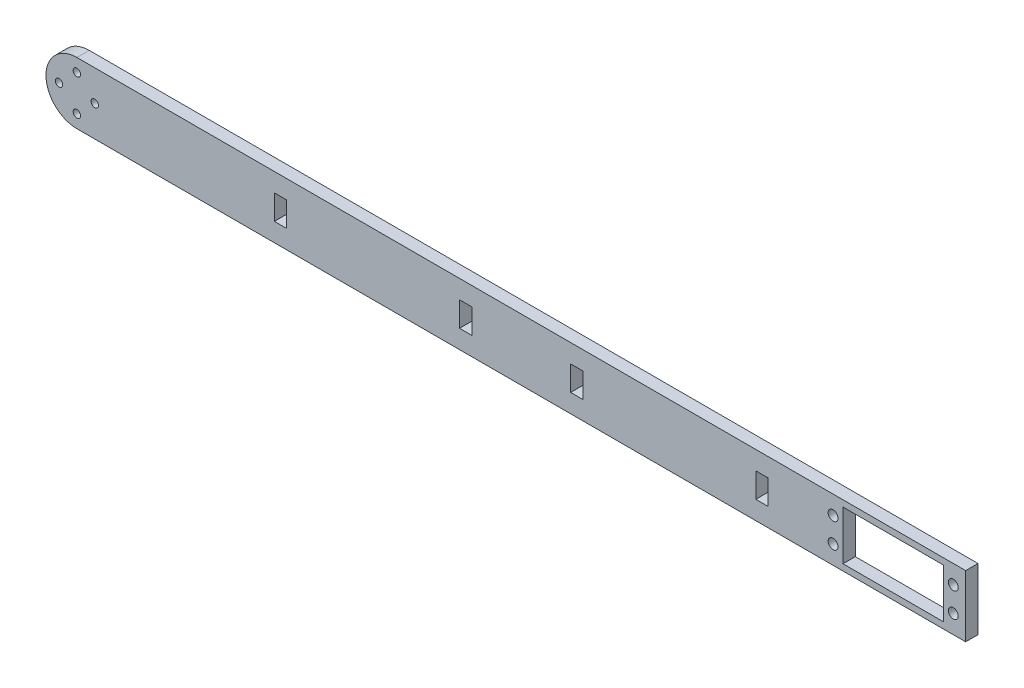
ISO-10303-21;
HEADER;
FILE_DESCRIPTION(('STEP AP214'),'2;1');
FILE_NAME('part.step','',(''),(''),'','','');
FILE_SCHEMA(('AUTOMOTIVE_DESIGN { 1 0 10303 214 1 1 1 1 }'));
ENDSEC;
DATA;
#1=APPLICATION_CONTEXT('core data for automotive mechanical design processes');
#2=APPLICATION_PROTOCOL_DEFINITION('international standard','automotive_design',2000,#1);
#3=PRODUCT_CONTEXT('',#1,'mechanical');
#4=PRODUCT('Part','Part','',(#3));
#5=PRODUCT_RELATED_PRODUCT_CATEGORY('part','',(#4));
#6=PRODUCT_DEFINITION_FORMATION('','',#4);
#7=PRODUCT_DEFINITION_CONTEXT('part definition',#1,'design');
#8=PRODUCT_DEFINITION('design','',#6,#7);
#9=PRODUCT_DEFINITION_SHAPE('','',#8);
#10=(LENGTH_UNIT() NAMED_UNIT(*) SI_UNIT(.MILLI.,.METRE.));
#11=(NAMED_UNIT(*) PLANE_ANGLE_UNIT() SI_UNIT($,.RADIAN.));
#12=(NAMED_UNIT(*) SI_UNIT($,.STERADIAN.) SOLID_ANGLE_UNIT());
#13=UNCERTAINTY_MEASURE_WITH_UNIT(LENGTH_MEASURE(1.E-05),#10,'distance_accuracy_value','');
#14=(GEOMETRIC_REPRESENTATION_CONTEXT(3) GLOBAL_UNCERTAINTY_ASSIGNED_CONTEXT((#13)) GLOBAL_UNIT_ASSIGNED_CONTEXT((#10,
#11,#12)) REPRESENTATION_CONTEXT('',''));
#15=CARTESIAN_POINT('',(0.,0.,0.));
#16=DIRECTION('',(0.,0.,1.));
#17=DIRECTION('',(1.,0.,0.));
#18=AXIS2_PLACEMENT_3D('',#15,#16,#17);
#19=CARTESIAN_POINT('',(0.,0.,5.));
#20=DIRECTION('',(0.,0.,1.));
#21=DIRECTION('',(1.,0.,0.));
#22=AXIS2_PLACEMENT_3D('',#19,#20,#21);
#23=PLANE('',#22);
#24=CARTESIAN_POINT('',(355.,-5.,5.));
#25=DIRECTION('',(0.,0.,1.));
#26=DIRECTION('',(-1.,0.,0.));
#27=AXIS2_PLACEMENT_3D('',#24,#25,#26);
#28=CIRCLE('',#27,2.);
#29=CARTESIAN_POINT('',(353.,-5.,5.));
#30=VERTEX_POINT('',#29);
#31=EDGE_CURVE('E908',#30,#30,#28,.T.);
#32=ORIENTED_EDGE('',*,*,#31,.F.);
#33=EDGE_LOOP('',(#32));
#34=FACE_BOUND('',#33,.T.);
#35=CARTESIAN_POINT('',(306.3,5.,5.));
#36=DIRECTION('',(0.,0.,1.));
#37=DIRECTION('',(-1.,0.,0.));
#38=AXIS2_PLACEMENT_3D('',#35,#36,#37);
#39=CIRCLE('',#38,2.);
#40=CARTESIAN_POINT('',(304.3,5.,5.));
#41=VERTEX_POINT('',#40);
#42=EDGE_CURVE('E916',#41,#41,#39,.T.);
#43=ORIENTED_EDGE('',*,*,#42,.F.);
#44=EDGE_LOOP('',(#43));
#45=FACE_BOUND('',#44,.T.);
#46=CARTESIAN_POINT('',(306.3,-5.,5.));
#47=DIRECTION('',(0.,0.,1.));
#48=DIRECTION('',(1.,0.,0.));
#49=AXIS2_PLACEMENT_3D('',#46,#47,#48);
#50=CIRCLE('',#49,2.);
#51=CARTESIAN_POINT('',(308.3,-5.,5.));
#52=VERTEX_POINT('',#51);
#53=EDGE_CURVE('E991',#52,#52,#50,.T.);
#54=ORIENTED_EDGE('',*,*,#53,.F.);
#55=EDGE_LOOP('',(#54));
#56=FACE_BOUND('',#55,.T.);
#57=CARTESIAN_POINT('',(355.,5.,5.));
#58=DIRECTION('',(0.,0.,1.));
#59=DIRECTION('',(1.,0.,0.));
#60=AXIS2_PLACEMENT_3D('',#57,#58,#59);
#61=CIRCLE('',#60,2.);
#62=CARTESIAN_POINT('',(357.,5.,5.));
#63=VERTEX_POINT('',#62);
#64=EDGE_CURVE('E295',#63,#63,#61,.T.);
#65=ORIENTED_EDGE('',*,*,#64,.F.);
#66=EDGE_LOOP('',(#65));
#67=FACE_BOUND('',#66,.T.);
#68=DIRECTION('',(-1.,0.,0.));
#69=VECTOR('',#68,1.);
#70=CARTESIAN_POINT('',(85.,5.,5.));
#71=LINE('',#70,#69);
#72=CARTESIAN_POINT('',(85.,5.,5.));
#73=VERTEX_POINT('',#72);
#74=CARTESIAN_POINT('',(80.,5.,5.));
#75=VERTEX_POINT('',#74);
#76=EDGE_CURVE('E114',#73,#75,#71,.T.);
#77=ORIENTED_EDGE('',*,*,#76,.F.);
#78=DIRECTION('',(0.,1.,0.));
#79=VECTOR('',#78,1.);
#80=CARTESIAN_POINT('',(85.,-5.,5.));
#81=LINE('',#80,#79);
#82=CARTESIAN_POINT('',(85.,-5.,5.));
#83=VERTEX_POINT('',#82);
#84=EDGE_CURVE('E367',#83,#73,#81,.T.);
#85=ORIENTED_EDGE('',*,*,#84,.F.);
#86=DIRECTION('',(1.,0.,0.));
#87=VECTOR('',#86,1.);
#88=CARTESIAN_POINT('',(85.,-5.,5.));
#89=LINE('',#88,#87);
#90=CARTESIAN_POINT('',(80.,-5.,5.));
#91=VERTEX_POINT('',#90);
#92=EDGE_CURVE('E387',#91,#83,#89,.T.);
#93=ORIENTED_EDGE('',*,*,#92,.F.);
#94=DIRECTION('',(0.,-1.,0.));
#95=VECTOR('',#94,1.);
#96=CARTESIAN_POINT('',(80.,-5.,5.));
#97=LINE('',#96,#95);
#98=EDGE_CURVE('E382',#75,#91,#97,.T.);
#99=ORIENTED_EDGE('',*,*,#98,.F.);
#100=EDGE_LOOP('',(#77,#85,#93,#99));
#101=FACE_BOUND('',#100,.T.);
#102=DIRECTION('',(1.,0.,0.));
#103=VECTOR('',#102,1.);
#104=CARTESIAN_POINT('',(205.,-4.99999999999973,5.));
#105=LINE('',#104,#103);
#106=CARTESIAN_POINT('',(200.,-4.9999999999997,5.));
#107=VERTEX_POINT('',#106);
#108=CARTESIAN_POINT('',(205.,-4.99999999999973,5.));
#109=VERTEX_POINT('',#108);
#110=EDGE_CURVE('E122',#107,#109,#105,.T.);
#111=ORIENTED_EDGE('',*,*,#110,.F.);
#112=DIRECTION('',(0.,-1.,0.));
#113=VECTOR('',#112,1.);
#114=CARTESIAN_POINT('',(200.,-4.9999999999997,5.));
#115=LINE('',#114,#113);
#116=CARTESIAN_POINT('',(200.,5.0000000000003,5.));
#117=VERTEX_POINT('',#116);
#118=EDGE_CURVE('E325',#117,#107,#115,.T.);
#119=ORIENTED_EDGE('',*,*,#118,.F.);
#120=DIRECTION('',(-1.,0.,0.));
#121=VECTOR('',#120,1.);
#122=CARTESIAN_POINT('',(205.,5.00000000000026,5.));
#123=LINE('',#122,#121);
#124=CARTESIAN_POINT('',(205.,5.00000000000026,5.));
#125=VERTEX_POINT('',#124);
#126=EDGE_CURVE('E345',#125,#117,#123,.T.);
#127=ORIENTED_EDGE('',*,*,#126,.F.);
#128=DIRECTION('',(0.,1.,0.));
#129=VECTOR('',#128,1.);
#130=CARTESIAN_POINT('',(205.,-4.99999999999973,5.));
#131=LINE('',#130,#129);
#132=EDGE_CURVE('E340',#109,#125,#131,.T.);
#133=ORIENTED_EDGE('',*,*,#132,.F.);
#134=EDGE_LOOP('',(#111,#119,#127,#133));
#135=FACE_BOUND('',#134,.T.);
#136=DIRECTION('',(0.,-1.,0.));
#137=VECTOR('',#136,1.);
#138=CARTESIAN_POINT('',(275.,-4.99999999999934,5.));
#139=LINE('',#138,#137);
#140=CARTESIAN_POINT('',(275.,5.00000000000065,5.));
#141=VERTEX_POINT('',#140);
#142=CARTESIAN_POINT('',(275.,-4.99999999999934,5.));
#143=VERTEX_POINT('',#142);
#144=EDGE_CURVE('E267',#141,#143,#139,.T.);
#145=ORIENTED_EDGE('',*,*,#144,.F.);
#146=DIRECTION('',(-1.,0.,0.));
#147=VECTOR('',#146,1.);
#148=CARTESIAN_POINT('',(275.,5.00000000000065,5.));
#149=LINE('',#148,#147);
#150=CARTESIAN_POINT('',(280.,5.00000000000074,5.));
#151=VERTEX_POINT('',#150);
#152=EDGE_CURVE('E288',#151,#141,#149,.T.);
#153=ORIENTED_EDGE('',*,*,#152,.F.);
#154=DIRECTION('',(0.,1.,0.));
#155=VECTOR('',#154,1.);
#156=CARTESIAN_POINT('',(280.,-4.99999999999925,5.));
#157=LINE('',#156,#155);
#158=CARTESIAN_POINT('',(280.,-4.99999999999925,5.));
#159=VERTEX_POINT('',#158);
#160=EDGE_CURVE('E292',#159,#151,#157,.T.);
#161=ORIENTED_EDGE('',*,*,#160,.F.);
#162=DIRECTION('',(1.,0.,0.));
#163=VECTOR('',#162,1.);
#164=CARTESIAN_POINT('',(275.,-4.99999999999934,5.));
#165=LINE('',#164,#163);
#166=EDGE_CURVE('E304',#143,#159,#165,.T.);
#167=ORIENTED_EDGE('',*,*,#166,.F.);
#168=EDGE_LOOP('',(#145,#153,#161,#167));
#169=FACE_BOUND('',#168,.T.);
#170=DIRECTION('',(0.,-1.,0.));
#171=VECTOR('',#170,1.);
#172=CARTESIAN_POINT('',(155.,-4.99999999999973,5.));
#173=LINE('',#172,#171);
#174=CARTESIAN_POINT('',(155.,5.00000000000026,5.));
#175=VERTEX_POINT('',#174);
#176=CARTESIAN_POINT('',(155.,-4.99999999999973,5.));
#177=VERTEX_POINT('',#176);
#178=EDGE_CURVE('E314',#175,#177,#173,.T.);
#179=ORIENTED_EDGE('',*,*,#178,.F.);
#180=DIRECTION('',(-1.,0.,0.));
#181=VECTOR('',#180,1.);
#182=CARTESIAN_POINT('',(155.,5.00000000000026,5.));
#183=LINE('',#182,#181);
#184=CARTESIAN_POINT('',(160.,5.0000000000003,5.));
#185=VERTEX_POINT('',#184);
#186=EDGE_CURVE('E409',#185,#175,#183,.T.);
#187=ORIENTED_EDGE('',*,*,#186,.F.);
#188=DIRECTION('',(0.,1.,0.));
#189=VECTOR('',#188,1.);
#190=CARTESIAN_POINT('',(160.,-4.9999999999997,5.));
#191=LINE('',#190,#189);
#192=CARTESIAN_POINT('',(160.,-4.9999999999997,5.));
#193=VERTEX_POINT('',#192);
#194=EDGE_CURVE('E428',#193,#185,#191,.T.);
#195=ORIENTED_EDGE('',*,*,#194,.F.);
#196=DIRECTION('',(1.,0.,0.));
#197=VECTOR('',#196,1.);
#198=CARTESIAN_POINT('',(155.,-4.99999999999973,5.));
#199=LINE('',#198,#197);
#200=EDGE_CURVE('E424',#177,#193,#199,.T.);
#201=ORIENTED_EDGE('',*,*,#200,.F.);
#202=EDGE_LOOP('',(#179,#187,#195,#201));
#203=FACE_BOUND('',#202,.T.);
#204=DIRECTION('',(-1.,0.,0.));
#205=VECTOR('',#204,1.);
#206=CARTESIAN_POINT('',(310.3,9.95,5.));
#207=LINE('',#206,#205);
#208=CARTESIAN_POINT('',(351.,9.95,5.));
#209=VERTEX_POINT('',#208);
#210=CARTESIAN_POINT('',(310.3,9.95,5.));
#211=VERTEX_POINT('',#210);
#212=EDGE_CURVE('E438',#209,#211,#207,.T.);
#213=ORIENTED_EDGE('',*,*,#212,.F.);
#214=DIRECTION('',(0.,1.,0.));
#215=VECTOR('',#214,1.);
#216=CARTESIAN_POINT('',(351.,9.95,5.));
#217=LINE('',#216,#215);
#218=CARTESIAN_POINT('',(351.,-9.95,5.));
#219=VERTEX_POINT('',#218);
#220=EDGE_CURVE('E453',#219,#209,#217,.T.);
#221=ORIENTED_EDGE('',*,*,#220,.F.);
#222=DIRECTION('',(1.,0.,0.));
#223=VECTOR('',#222,1.);
#224=CARTESIAN_POINT('',(351.,-9.95,5.));
#225=LINE('',#224,#223);
#226=CARTESIAN_POINT('',(310.3,-9.95,5.));
#227=VERTEX_POINT('',#226);
#228=EDGE_CURVE('E472',#227,#219,#225,.T.);
#229=ORIENTED_EDGE('',*,*,#228,.F.);
#230=DIRECTION('',(0.,-1.,0.));
#231=VECTOR('',#230,1.);
#232=CARTESIAN_POINT('',(310.3,-9.95,5.));
#233=LINE('',#232,#231);
#234=EDGE_CURVE('E468',#211,#227,#233,.T.);
#235=ORIENTED_EDGE('',*,*,#234,.F.);
#236=EDGE_LOOP('',(#213,#221,#229,#235));
#237=FACE_BOUND('',#236,.T.);
#238=CARTESIAN_POINT('',(7.2500000000002,-2.05613458905738E-13,5.));
#239=DIRECTION('',(0.,0.,1.));
#240=DIRECTION('',(1.,0.,0.));
#241=AXIS2_PLACEMENT_3D('',#238,#239,#240);
#242=CIRCLE('',#241,1.5);
#243=CARTESIAN_POINT('',(8.75000000000021,-2.05613458905738E-13,5.));
#244=VERTEX_POINT('',#243);
#245=EDGE_CURVE('E500',#244,#244,#242,.T.);
#246=ORIENTED_EDGE('',*,*,#245,.F.);
#247=EDGE_LOOP('',(#246));
#248=FACE_BOUND('',#247,.T.);
#249=CARTESIAN_POINT('',(-7.2499999999998,-2.05613458905738E-13,5.));
#250=DIRECTION('',(0.,0.,1.));
#251=DIRECTION('',(1.,0.,0.));
#252=AXIS2_PLACEMENT_3D('',#249,#250,#251);
#253=CIRCLE('',#252,1.5);
#254=CARTESIAN_POINT('',(-5.74999999999979,-2.05613458905738E-13,5.));
#255=VERTEX_POINT('',#254);
#256=EDGE_CURVE('E516',#255,#255,#253,.T.);
#257=ORIENTED_EDGE('',*,*,#256,.F.);
#258=EDGE_LOOP('',(#257));
#259=FACE_BOUND('',#258,.T.);
#260=CARTESIAN_POINT('',(0.,0.,5.));
#261=DIRECTION('',(0.,0.,1.));
#262=DIRECTION('',(1.,0.,0.));
#263=AXIS2_PLACEMENT_3D('',#260,#261,#262);
#264=CIRCLE('',#263,12.5);
#265=CARTESIAN_POINT('',(0.,12.5,5.));
#266=VERTEX_POINT('',#265);
#267=CARTESIAN_POINT('',(0.,-12.5,5.));
#268=VERTEX_POINT('',#267);
#269=EDGE_CURVE('E524',#266,#268,#264,.T.);
#270=ORIENTED_EDGE('',*,*,#269,.T.);
#271=DIRECTION('',(1.,0.,0.));
#272=VECTOR('',#271,1.);
#273=CARTESIAN_POINT('',(0.,-12.5,5.));
#274=LINE('',#273,#272);
#275=CARTESIAN_POINT('',(360.,-12.5,5.));
#276=VERTEX_POINT('',#275);
#277=EDGE_CURVE('E528',#268,#276,#274,.T.);
#278=ORIENTED_EDGE('',*,*,#277,.T.);
#279=DIRECTION('',(0.,-1.,0.));
#280=VECTOR('',#279,1.);
#281=CARTESIAN_POINT('',(360.,12.5,5.));
#282=LINE('',#281,#280);
#283=CARTESIAN_POINT('',(360.,12.5,5.));
#284=VERTEX_POINT('',#283);
#285=EDGE_CURVE('E532',#284,#276,#282,.T.);
#286=ORIENTED_EDGE('',*,*,#285,.F.);
#287=DIRECTION('',(1.,0.,0.));
#288=VECTOR('',#287,1.);
#289=CARTESIAN_POINT('',(0.,12.5,5.));
#290=LINE('',#289,#288);
#291=EDGE_CURVE('E536',#266,#284,#290,.T.);
#292=ORIENTED_EDGE('',*,*,#291,.F.);
#293=EDGE_LOOP('',(#270,#278,#286,#292));
#294=FACE_BOUND('',#293,.T.);
#295=CARTESIAN_POINT('',(2.05595492690342E-13,7.24999999999979,5.));
#296=DIRECTION('',(0.,0.,1.));
#297=DIRECTION('',(1.,0.,0.));
#298=AXIS2_PLACEMENT_3D('',#295,#296,#297);
#299=CIRCLE('',#298,1.5);
#300=CARTESIAN_POINT('',(1.50000000000021,7.24999999999979,5.));
#301=VERTEX_POINT('',#300);
#302=EDGE_CURVE('E508',#301,#301,#299,.T.);
#303=ORIENTED_EDGE('',*,*,#302,.F.);
#304=EDGE_LOOP('',(#303));
#305=FACE_BOUND('',#304,.T.);
#306=CARTESIAN_POINT('',(2.03819754831578E-13,-7.25000000000021,5.));
#307=DIRECTION('',(0.,0.,1.));
#308=DIRECTION('',(1.,0.,0.));
#309=AXIS2_PLACEMENT_3D('',#306,#307,#308);
#310=CIRCLE('',#309,1.5);
#311=CARTESIAN_POINT('',(1.5000000000002,-7.25000000000021,5.));
#312=VERTEX_POINT('',#311);
#313=EDGE_CURVE('E492',#312,#312,#310,.T.);
#314=ORIENTED_EDGE('',*,*,#313,.F.);
#315=EDGE_LOOP('',(#314));
#316=FACE_BOUND('',#315,.T.);
#317=ADVANCED_FACE('F98',(#34,#45,#56,#67,#101,#135,#169,#203,#237,#248,#259,#294,#305,#316),
#23,.T.);
#318=CARTESIAN_POINT('',(0.,0.,0.));
#319=DIRECTION('',(0.,0.,1.));
#320=DIRECTION('',(1.,0.,0.));
#321=AXIS2_PLACEMENT_3D('',#318,#319,#320);
#322=PLANE('',#321);
#323=CARTESIAN_POINT('',(355.,-5.,0.));
#324=DIRECTION('',(0.,0.,1.));
#325=DIRECTION('',(-1.,0.,0.));
#326=AXIS2_PLACEMENT_3D('',#323,#324,#325);
#327=CIRCLE('',#326,2.);
#328=CARTESIAN_POINT('',(353.,-5.,0.));
#329=VERTEX_POINT('',#328);
#330=EDGE_CURVE('E906',#329,#329,#327,.T.);
#331=ORIENTED_EDGE('',*,*,#330,.T.);
#332=EDGE_LOOP('',(#331));
#333=FACE_BOUND('',#332,.T.);
#334=CARTESIAN_POINT('',(306.3,5.,0.));
#335=DIRECTION('',(0.,0.,1.));
#336=DIRECTION('',(-1.,0.,0.));
#337=AXIS2_PLACEMENT_3D('',#334,#335,#336);
#338=CIRCLE('',#337,2.);
#339=CARTESIAN_POINT('',(304.3,5.,0.));
#340=VERTEX_POINT('',#339);
#341=EDGE_CURVE('E910',#340,#340,#338,.T.);
#342=ORIENTED_EDGE('',*,*,#341,.T.);
#343=EDGE_LOOP('',(#342));
#344=FACE_BOUND('',#343,.T.);
#345=CARTESIAN_POINT('',(306.3,-5.,0.));
#346=DIRECTION('',(0.,0.,1.));
#347=DIRECTION('',(1.,0.,0.));
#348=AXIS2_PLACEMENT_3D('',#345,#346,#347);
#349=CIRCLE('',#348,2.);
#350=CARTESIAN_POINT('',(308.3,-5.,0.));
#351=VERTEX_POINT('',#350);
#352=EDGE_CURVE('E922',#351,#351,#349,.T.);
#353=ORIENTED_EDGE('',*,*,#352,.T.);
#354=EDGE_LOOP('',(#353));
#355=FACE_BOUND('',#354,.T.);
#356=CARTESIAN_POINT('',(355.,5.,0.));
#357=DIRECTION('',(0.,0.,1.));
#358=DIRECTION('',(1.,0.,0.));
#359=AXIS2_PLACEMENT_3D('',#356,#357,#358);
#360=CIRCLE('',#359,2.);
#361=CARTESIAN_POINT('',(357.,5.,0.));
#362=VERTEX_POINT('',#361);
#363=EDGE_CURVE('E383',#362,#362,#360,.T.);
#364=ORIENTED_EDGE('',*,*,#363,.T.);
#365=EDGE_LOOP('',(#364));
#366=FACE_BOUND('',#365,.T.);
#367=DIRECTION('',(0.,1.,0.));
#368=VECTOR('',#367,1.);
#369=CARTESIAN_POINT('',(85.,-5.,0.));
#370=LINE('',#369,#368);
#371=CARTESIAN_POINT('',(85.,-5.,0.));
#372=VERTEX_POINT('',#371);
#373=CARTESIAN_POINT('',(85.,5.,0.));
#374=VERTEX_POINT('',#373);
#375=EDGE_CURVE('E375',#372,#374,#370,.T.);
#376=ORIENTED_EDGE('',*,*,#375,.T.);
#377=DIRECTION('',(-1.,0.,0.));
#378=VECTOR('',#377,1.);
#379=CARTESIAN_POINT('',(85.,5.,0.));
#380=LINE('',#379,#378);
#381=CARTESIAN_POINT('',(80.,5.,0.));
#382=VERTEX_POINT('',#381);
#383=EDGE_CURVE('E362',#374,#382,#380,.T.);
#384=ORIENTED_EDGE('',*,*,#383,.T.);
#385=DIRECTION('',(0.,-1.,0.));
#386=VECTOR('',#385,1.);
#387=CARTESIAN_POINT('',(80.,-5.,0.));
#388=LINE('',#387,#386);
#389=CARTESIAN_POINT('',(80.,-5.,0.));
#390=VERTEX_POINT('',#389);
#391=EDGE_CURVE('E366',#382,#390,#388,.T.);
#392=ORIENTED_EDGE('',*,*,#391,.T.);
#393=DIRECTION('',(1.,0.,0.));
#394=VECTOR('',#393,1.);
#395=CARTESIAN_POINT('',(85.,-5.,0.));
#396=LINE('',#395,#394);
#397=EDGE_CURVE('E371',#390,#372,#396,.T.);
#398=ORIENTED_EDGE('',*,*,#397,.T.);
#399=EDGE_LOOP('',(#376,#384,#392,#398));
#400=FACE_BOUND('',#399,.T.);
#401=DIRECTION('',(0.,-1.,0.));
#402=VECTOR('',#401,1.);
#403=CARTESIAN_POINT('',(200.,-4.9999999999997,0.));
#404=LINE('',#403,#402);
#405=CARTESIAN_POINT('',(200.,5.0000000000003,0.));
#406=VERTEX_POINT('',#405);
#407=CARTESIAN_POINT('',(200.,-4.9999999999997,0.));
#408=VERTEX_POINT('',#407);
#409=EDGE_CURVE('E333',#406,#408,#404,.T.);
#410=ORIENTED_EDGE('',*,*,#409,.T.);
#411=DIRECTION('',(1.,0.,0.));
#412=VECTOR('',#411,1.);
#413=CARTESIAN_POINT('',(205.,-4.99999999999973,0.));
#414=LINE('',#413,#412);
#415=CARTESIAN_POINT('',(205.,-4.99999999999973,0.));
#416=VERTEX_POINT('',#415);
#417=EDGE_CURVE('E320',#408,#416,#414,.T.);
#418=ORIENTED_EDGE('',*,*,#417,.T.);
#419=DIRECTION('',(0.,1.,0.));
#420=VECTOR('',#419,1.);
#421=CARTESIAN_POINT('',(205.,-4.99999999999973,0.));
#422=LINE('',#421,#420);
#423=CARTESIAN_POINT('',(205.,5.00000000000026,0.));
#424=VERTEX_POINT('',#423);
#425=EDGE_CURVE('E324',#416,#424,#422,.T.);
#426=ORIENTED_EDGE('',*,*,#425,.T.);
#427=DIRECTION('',(-1.,0.,0.));
#428=VECTOR('',#427,1.);
#429=CARTESIAN_POINT('',(205.,5.00000000000026,0.));
#430=LINE('',#429,#428);
#431=EDGE_CURVE('E329',#424,#406,#430,.T.);
#432=ORIENTED_EDGE('',*,*,#431,.T.);
#433=EDGE_LOOP('',(#410,#418,#426,#432));
#434=FACE_BOUND('',#433,.T.);
#435=DIRECTION('',(-1.,0.,0.));
#436=VECTOR('',#435,1.);
#437=CARTESIAN_POINT('',(275.,5.00000000000065,0.));
#438=LINE('',#437,#436);
#439=CARTESIAN_POINT('',(280.,5.00000000000074,0.));
#440=VERTEX_POINT('',#439);
#441=CARTESIAN_POINT('',(275.,5.00000000000065,0.));
#442=VERTEX_POINT('',#441);
#443=EDGE_CURVE('E273',#440,#442,#438,.T.);
#444=ORIENTED_EDGE('',*,*,#443,.T.);
#445=DIRECTION('',(0.,-1.,0.));
#446=VECTOR('',#445,1.);
#447=CARTESIAN_POINT('',(275.,-4.99999999999934,0.));
#448=LINE('',#447,#446);
#449=CARTESIAN_POINT('',(275.,-4.99999999999934,0.));
#450=VERTEX_POINT('',#449);
#451=EDGE_CURVE('E264',#442,#450,#448,.T.);
#452=ORIENTED_EDGE('',*,*,#451,.T.);
#453=DIRECTION('',(1.,0.,0.));
#454=VECTOR('',#453,1.);
#455=CARTESIAN_POINT('',(275.,-4.99999999999934,0.));
#456=LINE('',#455,#454);
#457=CARTESIAN_POINT('',(280.,-4.99999999999925,0.));
#458=VERTEX_POINT('',#457);
#459=EDGE_CURVE('E277',#450,#458,#456,.T.);
#460=ORIENTED_EDGE('',*,*,#459,.T.);
#461=DIRECTION('',(0.,1.,0.));
#462=VECTOR('',#461,1.);
#463=CARTESIAN_POINT('',(280.,-4.99999999999925,0.));
#464=LINE('',#463,#462);
#465=EDGE_CURVE('E282',#458,#440,#464,.T.);
#466=ORIENTED_EDGE('',*,*,#465,.T.);
#467=EDGE_LOOP('',(#444,#452,#460,#466));
#468=FACE_BOUND('',#467,.T.);
#469=DIRECTION('',(-1.,0.,0.));
#470=VECTOR('',#469,1.);
#471=CARTESIAN_POINT('',(155.,5.00000000000026,0.));
#472=LINE('',#471,#470);
#473=CARTESIAN_POINT('',(160.,5.0000000000003,0.));
#474=VERTEX_POINT('',#473);
#475=CARTESIAN_POINT('',(155.,5.00000000000026,0.));
#476=VERTEX_POINT('',#475);
#477=EDGE_CURVE('E417',#474,#476,#472,.T.);
#478=ORIENTED_EDGE('',*,*,#477,.T.);
#479=DIRECTION('',(0.,-1.,0.));
#480=VECTOR('',#479,1.);
#481=CARTESIAN_POINT('',(155.,-4.99999999999973,0.));
#482=LINE('',#481,#480);
#483=CARTESIAN_POINT('',(155.,-4.99999999999973,0.));
#484=VERTEX_POINT('',#483);
#485=EDGE_CURVE('E404',#476,#484,#482,.T.);
#486=ORIENTED_EDGE('',*,*,#485,.T.);
#487=DIRECTION('',(1.,0.,0.));
#488=VECTOR('',#487,1.);
#489=CARTESIAN_POINT('',(155.,-4.99999999999973,0.));
#490=LINE('',#489,#488);
#491=CARTESIAN_POINT('',(160.,-4.9999999999997,0.));
#492=VERTEX_POINT('',#491);
#493=EDGE_CURVE('E408',#484,#492,#490,.T.);
#494=ORIENTED_EDGE('',*,*,#493,.T.);
#495=DIRECTION('',(0.,1.,0.));
#496=VECTOR('',#495,1.);
#497=CARTESIAN_POINT('',(160.,-4.9999999999997,0.));
#498=LINE('',#497,#496);
#499=EDGE_CURVE('E413',#492,#474,#498,.T.);
#500=ORIENTED_EDGE('',*,*,#499,.T.);
#501=EDGE_LOOP('',(#478,#486,#494,#500));
#502=FACE_BOUND('',#501,.T.);
#503=DIRECTION('',(0.,1.,0.));
#504=VECTOR('',#503,1.);
#505=CARTESIAN_POINT('',(351.,9.95,0.));
#506=LINE('',#505,#504);
#507=CARTESIAN_POINT('',(351.,-9.95,0.));
#508=VERTEX_POINT('',#507);
#509=CARTESIAN_POINT('',(351.,9.95,0.));
#510=VERTEX_POINT('',#509);
#511=EDGE_CURVE('E461',#508,#510,#506,.T.);
#512=ORIENTED_EDGE('',*,*,#511,.T.);
#513=DIRECTION('',(-1.,0.,0.));
#514=VECTOR('',#513,1.);
#515=CARTESIAN_POINT('',(310.3,9.95,0.));
#516=LINE('',#515,#514);
#517=CARTESIAN_POINT('',(310.3,9.95,0.));
#518=VERTEX_POINT('',#517);
#519=EDGE_CURVE('E448',#510,#518,#516,.T.);
#520=ORIENTED_EDGE('',*,*,#519,.T.);
#521=DIRECTION('',(0.,-1.,0.));
#522=VECTOR('',#521,1.);
#523=CARTESIAN_POINT('',(310.3,-9.95,0.));
#524=LINE('',#523,#522);
#525=CARTESIAN_POINT('',(310.3,-9.95,0.));
#526=VERTEX_POINT('',#525);
#527=EDGE_CURVE('E452',#518,#526,#524,.T.);
#528=ORIENTED_EDGE('',*,*,#527,.T.);
#529=DIRECTION('',(1.,0.,0.));
#530=VECTOR('',#529,1.);
#531=CARTESIAN_POINT('',(351.,-9.95,0.));
#532=LINE('',#531,#530);
#533=EDGE_CURVE('E457',#526,#508,#532,.T.);
#534=ORIENTED_EDGE('',*,*,#533,.T.);
#535=EDGE_LOOP('',(#512,#520,#528,#534));
#536=FACE_BOUND('',#535,.T.);
#537=CARTESIAN_POINT('',(0.,0.,0.));
#538=DIRECTION('',(0.,0.,1.));
#539=DIRECTION('',(1.,0.,0.));
#540=AXIS2_PLACEMENT_3D('',#537,#538,#539);
#541=CIRCLE('',#540,12.5);
#542=CARTESIAN_POINT('',(0.,12.5,0.));
#543=VERTEX_POINT('',#542);
#544=CARTESIAN_POINT('',(0.,-12.5,0.));
#545=VERTEX_POINT('',#544);
#546=EDGE_CURVE('E520',#543,#545,#541,.T.);
#547=ORIENTED_EDGE('',*,*,#546,.F.);
#548=DIRECTION('',(1.,0.,0.));
#549=VECTOR('',#548,1.);
#550=CARTESIAN_POINT('',(0.,12.5,0.));
#551=LINE('',#550,#549);
#552=CARTESIAN_POINT('',(360.,12.5,0.));
#553=VERTEX_POINT('',#552);
#554=EDGE_CURVE('E529',#543,#553,#551,.T.);
#555=ORIENTED_EDGE('',*,*,#554,.T.);
#556=DIRECTION('',(0.,-1.,0.));
#557=VECTOR('',#556,1.);
#558=CARTESIAN_POINT('',(360.,12.5,0.));
#559=LINE('',#558,#557);
#560=CARTESIAN_POINT('',(360.,-12.5,0.));
#561=VERTEX_POINT('',#560);
#562=EDGE_CURVE('E548',#553,#561,#559,.T.);
#563=ORIENTED_EDGE('',*,*,#562,.T.);
#564=DIRECTION('',(1.,0.,0.));
#565=VECTOR('',#564,1.);
#566=CARTESIAN_POINT('',(0.,-12.5,0.));
#567=LINE('',#566,#565);
#568=EDGE_CURVE('E544',#545,#561,#567,.T.);
#569=ORIENTED_EDGE('',*,*,#568,.F.);
#570=EDGE_LOOP('',(#547,#555,#563,#569));
#571=FACE_BOUND('',#570,.T.);
#572=CARTESIAN_POINT('',(-7.2499999999998,-2.05613458905738E-13,0.));
#573=DIRECTION('',(0.,0.,1.));
#574=DIRECTION('',(1.,0.,0.));
#575=AXIS2_PLACEMENT_3D('',#572,#573,#574);
#576=CIRCLE('',#575,1.5);
#577=CARTESIAN_POINT('',(-5.74999999999979,-2.05613458905738E-13,0.));
#578=VERTEX_POINT('',#577);
#579=EDGE_CURVE('E512',#578,#578,#576,.T.);
#580=ORIENTED_EDGE('',*,*,#579,.T.);
#581=EDGE_LOOP('',(#580));
#582=FACE_BOUND('',#581,.T.);
#583=CARTESIAN_POINT('',(2.05595492690342E-13,7.24999999999979,0.));
#584=DIRECTION('',(0.,0.,1.));
#585=DIRECTION('',(1.,0.,0.));
#586=AXIS2_PLACEMENT_3D('',#583,#584,#585);
#587=CIRCLE('',#586,1.5);
#588=CARTESIAN_POINT('',(1.50000000000021,7.24999999999979,0.));
#589=VERTEX_POINT('',#588);
#590=EDGE_CURVE('E504',#589,#589,#587,.T.);
#591=ORIENTED_EDGE('',*,*,#590,.T.);
#592=EDGE_LOOP('',(#591));
#593=FACE_BOUND('',#592,.T.);
#594=CARTESIAN_POINT('',(7.2500000000002,-2.05613458905738E-13,0.));
#595=DIRECTION('',(0.,0.,1.));
#596=DIRECTION('',(1.,0.,0.));
#597=AXIS2_PLACEMENT_3D('',#594,#595,#596);
#598=CIRCLE('',#597,1.5);
#599=CARTESIAN_POINT('',(8.75000000000021,-2.05613458905738E-13,0.));
#600=VERTEX_POINT('',#599);
#601=EDGE_CURVE('E496',#600,#600,#598,.T.);
#602=ORIENTED_EDGE('',*,*,#601,.T.);
#603=EDGE_LOOP('',(#602));
#604=FACE_BOUND('',#603,.T.);
#605=CARTESIAN_POINT('',(2.03819754831578E-13,-7.25000000000021,0.));
#606=DIRECTION('',(0.,0.,1.));
#607=DIRECTION('',(1.,0.,0.));
#608=AXIS2_PLACEMENT_3D('',#605,#606,#607);
#609=CIRCLE('',#608,1.5);
#610=CARTESIAN_POINT('',(1.5000000000002,-7.25000000000021,0.));
#611=VERTEX_POINT('',#610);
#612=EDGE_CURVE('E482',#611,#611,#609,.T.);
#613=ORIENTED_EDGE('',*,*,#612,.T.);
#614=EDGE_LOOP('',(#613));
#615=FACE_BOUND('',#614,.T.);
#616=ADVANCED_FACE('F284',(#333,#344,#355,#366,#400,#434,#468,#502,#536,#571,#582,#593,#604,
#615),#322,.F.);
#617=CARTESIAN_POINT('',(0.,0.,5.));
#618=DIRECTION('',(0.,0.,-1.));
#619=DIRECTION('',(-1.,0.,0.));
#620=AXIS2_PLACEMENT_3D('',#617,#618,#619);
#621=CYLINDRICAL_SURFACE('',#620,12.5);
#622=ORIENTED_EDGE('',*,*,#546,.T.);
#623=DIRECTION('',(0.,0.,-1.));
#624=VECTOR('',#623,1.);
#625=CARTESIAN_POINT('',(0.,-12.5,5.));
#626=LINE('',#625,#624);
#627=EDGE_CURVE('E12',#268,#545,#626,.T.);
#628=ORIENTED_EDGE('',*,*,#627,.F.);
#629=ORIENTED_EDGE('',*,*,#269,.F.);
#630=DIRECTION('',(0.,0.,-1.));
#631=VECTOR('',#630,1.);
#632=CARTESIAN_POINT('',(0.,12.5,5.));
#633=LINE('',#632,#631);
#634=EDGE_CURVE('E540',#266,#543,#633,.T.);
#635=ORIENTED_EDGE('',*,*,#634,.T.);
#636=EDGE_LOOP('',(#622,#628,#629,#635));
#637=FACE_BOUND('',#636,.T.);
#638=ADVANCED_FACE('F100',(#637),#621,.T.);
#639=CARTESIAN_POINT('',(0.,-12.5,5.));
#640=DIRECTION('',(0.,1.,0.));
#641=DIRECTION('',(0.,0.,1.));
#642=AXIS2_PLACEMENT_3D('',#639,#640,#641);
#643=PLANE('',#642);
#644=ORIENTED_EDGE('',*,*,#568,.T.);
#645=DIRECTION('',(0.,0.,-1.));
#646=VECTOR('',#645,1.);
#647=CARTESIAN_POINT('',(360.,-12.5,5.));
#648=LINE('',#647,#646);
#649=EDGE_CURVE('E107',#276,#561,#648,.T.);
#650=ORIENTED_EDGE('',*,*,#649,.F.);
#651=ORIENTED_EDGE('',*,*,#277,.F.);
#652=ORIENTED_EDGE('',*,*,#627,.T.);
#653=EDGE_LOOP('',(#644,#650,#651,#652));
#654=FACE_BOUND('',#653,.T.);
#655=ADVANCED_FACE('F566',(#654),#643,.F.);
#656=CARTESIAN_POINT('',(360.,12.5,5.));
#657=DIRECTION('',(1.,0.,0.));
#658=DIRECTION('',(0.,0.,-1.));
#659=AXIS2_PLACEMENT_3D('',#656,#657,#658);
#660=PLANE('',#659);
#661=ORIENTED_EDGE('',*,*,#562,.F.);
#662=DIRECTION('',(0.,0.,-1.));
#663=VECTOR('',#662,1.);
#664=CARTESIAN_POINT('',(360.,12.5,5.));
#665=LINE('',#664,#663);
#666=EDGE_CURVE('E557',#284,#553,#665,.T.);
#667=ORIENTED_EDGE('',*,*,#666,.F.);
#668=ORIENTED_EDGE('',*,*,#285,.T.);
#669=ORIENTED_EDGE('',*,*,#649,.T.);
#670=EDGE_LOOP('',(#661,#667,#668,#669));
#671=FACE_BOUND('',#670,.T.);
#672=ADVANCED_FACE('F563',(#671),#660,.T.);
#673=CARTESIAN_POINT('',(0.,12.5,5.));
#674=DIRECTION('',(0.,1.,0.));
#675=DIRECTION('',(0.,0.,1.));
#676=AXIS2_PLACEMENT_3D('',#673,#674,#675);
#677=PLANE('',#676);
#678=ORIENTED_EDGE('',*,*,#554,.F.);
#679=ORIENTED_EDGE('',*,*,#634,.F.);
#680=ORIENTED_EDGE('',*,*,#291,.T.);
#681=ORIENTED_EDGE('',*,*,#666,.T.);
#682=EDGE_LOOP('',(#678,#679,#680,#681));
#683=FACE_BOUND('',#682,.T.);
#684=ADVANCED_FACE('F573',(#683),#677,.T.);
#685=CARTESIAN_POINT('',(-7.2499999999998,-2.05613458905738E-13,5.));
#686=DIRECTION('',(0.,0.,-1.));
#687=DIRECTION('',(-1.,0.,0.));
#688=AXIS2_PLACEMENT_3D('',#685,#686,#687);
#689=CYLINDRICAL_SURFACE('',#688,1.5);
#690=ORIENTED_EDGE('',*,*,#256,.T.);
#691=EDGE_LOOP('',(#690));
#692=FACE_BOUND('',#691,.T.);
#693=ORIENTED_EDGE('',*,*,#579,.F.);
#694=EDGE_LOOP('',(#693));
#695=FACE_BOUND('',#694,.T.);
#696=ADVANCED_FACE('F594',(#692,#695),#689,.F.);
#697=CARTESIAN_POINT('',(2.05595492690342E-13,7.24999999999979,5.));
#698=DIRECTION('',(0.,0.,-1.));
#699=DIRECTION('',(-1.,0.,0.));
#700=AXIS2_PLACEMENT_3D('',#697,#698,#699);
#701=CYLINDRICAL_SURFACE('',#700,1.5);
#702=ORIENTED_EDGE('',*,*,#302,.T.);
#703=EDGE_LOOP('',(#702));
#704=FACE_BOUND('',#703,.T.);
#705=ORIENTED_EDGE('',*,*,#590,.F.);
#706=EDGE_LOOP('',(#705));
#707=FACE_BOUND('',#706,.T.);
#708=ADVANCED_FACE('F614',(#704,#707),#701,.F.);
#709=CARTESIAN_POINT('',(7.2500000000002,-2.05613458905738E-13,5.));
#710=DIRECTION('',(0.,0.,-1.));
#711=DIRECTION('',(-1.,0.,0.));
#712=AXIS2_PLACEMENT_3D('',#709,#710,#711);
#713=CYLINDRICAL_SURFACE('',#712,1.5);
#714=ORIENTED_EDGE('',*,*,#245,.T.);
#715=EDGE_LOOP('',(#714));
#716=FACE_BOUND('',#715,.T.);
#717=ORIENTED_EDGE('',*,*,#601,.F.);
#718=EDGE_LOOP('',(#717));
#719=FACE_BOUND('',#718,.T.);
#720=ADVANCED_FACE('F621',(#716,#719),#713,.F.);
#721=CARTESIAN_POINT('',(2.03819754831578E-13,-7.25000000000021,5.));
#722=DIRECTION('',(0.,0.,-1.));
#723=DIRECTION('',(-1.,0.,0.));
#724=AXIS2_PLACEMENT_3D('',#721,#722,#723);
#725=CYLINDRICAL_SURFACE('',#724,1.5);
#726=ORIENTED_EDGE('',*,*,#313,.T.);
#727=EDGE_LOOP('',(#726));
#728=FACE_BOUND('',#727,.T.);
#729=ORIENTED_EDGE('',*,*,#612,.F.);
#730=EDGE_LOOP('',(#729));
#731=FACE_BOUND('',#730,.T.);
#732=ADVANCED_FACE('F628',(#728,#731),#725,.F.);
#733=CARTESIAN_POINT('',(310.3,9.95,0.));
#734=DIRECTION('',(0.,1.,0.));
#735=DIRECTION('',(0.,0.,1.));
#736=AXIS2_PLACEMENT_3D('',#733,#734,#735);
#737=PLANE('',#736);
#738=ORIENTED_EDGE('',*,*,#212,.T.);
#739=DIRECTION('',(0.,0.,1.));
#740=VECTOR('',#739,1.);
#741=CARTESIAN_POINT('',(310.3,9.95,0.));
#742=LINE('',#741,#740);
#743=EDGE_CURVE('E465',#518,#211,#742,.T.);
#744=ORIENTED_EDGE('',*,*,#743,.F.);
#745=ORIENTED_EDGE('',*,*,#519,.F.);
#746=DIRECTION('',(0.,0.,1.));
#747=VECTOR('',#746,1.);
#748=CARTESIAN_POINT('',(351.,9.95,0.));
#749=LINE('',#748,#747);
#750=EDGE_CURVE('E479',#510,#209,#749,.T.);
#751=ORIENTED_EDGE('',*,*,#750,.T.);
#752=EDGE_LOOP('',(#738,#744,#745,#751));
#753=FACE_BOUND('',#752,.T.);
#754=ADVANCED_FACE('F636',(#753),#737,.F.);
#755=CARTESIAN_POINT('',(351.,9.95,0.));
#756=DIRECTION('',(1.,0.,0.));
#757=DIRECTION('',(0.,0.,-1.));
#758=AXIS2_PLACEMENT_3D('',#755,#756,#757);
#759=PLANE('',#758);
#760=ORIENTED_EDGE('',*,*,#220,.T.);
#761=ORIENTED_EDGE('',*,*,#750,.F.);
#762=ORIENTED_EDGE('',*,*,#511,.F.);
#763=DIRECTION('',(0.,0.,1.));
#764=VECTOR('',#763,1.);
#765=CARTESIAN_POINT('',(351.,-9.95,0.));
#766=LINE('',#765,#764);
#767=EDGE_CURVE('E483',#508,#219,#766,.T.);
#768=ORIENTED_EDGE('',*,*,#767,.T.);
#769=EDGE_LOOP('',(#760,#761,#762,#768));
#770=FACE_BOUND('',#769,.T.);
#771=ADVANCED_FACE('F644',(#770),#759,.F.);
#772=CARTESIAN_POINT('',(351.,-9.95,0.));
#773=DIRECTION('',(0.,-1.,0.));
#774=DIRECTION('',(1.,0.,0.));
#775=AXIS2_PLACEMENT_3D('',#772,#773,#774);
#776=PLANE('',#775);
#777=ORIENTED_EDGE('',*,*,#228,.T.);
#778=ORIENTED_EDGE('',*,*,#767,.F.);
#779=ORIENTED_EDGE('',*,*,#533,.F.);
#780=DIRECTION('',(0.,0.,1.));
#781=VECTOR('',#780,1.);
#782=CARTESIAN_POINT('',(310.3,-9.95,0.));
#783=LINE('',#782,#781);
#784=EDGE_CURVE('E486',#526,#227,#783,.T.);
#785=ORIENTED_EDGE('',*,*,#784,.T.);
#786=EDGE_LOOP('',(#777,#778,#779,#785));
#787=FACE_BOUND('',#786,.T.);
#788=ADVANCED_FACE('F652',(#787),#776,.F.);
#789=CARTESIAN_POINT('',(310.3,-9.95,0.));
#790=DIRECTION('',(-1.,0.,0.));
#791=DIRECTION('',(0.,0.,1.));
#792=AXIS2_PLACEMENT_3D('',#789,#790,#791);
#793=PLANE('',#792);
#794=ORIENTED_EDGE('',*,*,#234,.T.);
#795=ORIENTED_EDGE('',*,*,#784,.F.);
#796=ORIENTED_EDGE('',*,*,#527,.F.);
#797=ORIENTED_EDGE('',*,*,#743,.T.);
#798=EDGE_LOOP('',(#794,#795,#796,#797));
#799=FACE_BOUND('',#798,.T.);
#800=ADVANCED_FACE('F660',(#799),#793,.F.);
#801=CARTESIAN_POINT('',(155.,-4.99999999999973,0.));
#802=DIRECTION('',(-1.,0.,0.));
#803=DIRECTION('',(0.,-1.,0.));
#804=AXIS2_PLACEMENT_3D('',#801,#802,#803);
#805=PLANE('',#804);
#806=ORIENTED_EDGE('',*,*,#178,.T.);
#807=DIRECTION('',(0.,0.,1.));
#808=VECTOR('',#807,1.);
#809=CARTESIAN_POINT('',(155.,-4.99999999999973,0.));
#810=LINE('',#809,#808);
#811=EDGE_CURVE('E421',#484,#177,#810,.T.);
#812=ORIENTED_EDGE('',*,*,#811,.F.);
#813=ORIENTED_EDGE('',*,*,#485,.F.);
#814=DIRECTION('',(0.,0.,1.));
#815=VECTOR('',#814,1.);
#816=CARTESIAN_POINT('',(155.,5.00000000000026,0.));
#817=LINE('',#816,#815);
#818=EDGE_CURVE('E435',#476,#175,#817,.T.);
#819=ORIENTED_EDGE('',*,*,#818,.T.);
#820=EDGE_LOOP('',(#806,#812,#813,#819));
#821=FACE_BOUND('',#820,.T.);
#822=ADVANCED_FACE('F668',(#821),#805,.F.);
#823=CARTESIAN_POINT('',(155.,5.00000000000026,0.));
#824=DIRECTION('',(0.,1.,0.));
#825=DIRECTION('',(-1.,0.,0.));
#826=AXIS2_PLACEMENT_3D('',#823,#824,#825);
#827=PLANE('',#826);
#828=ORIENTED_EDGE('',*,*,#186,.T.);
#829=ORIENTED_EDGE('',*,*,#818,.F.);
#830=ORIENTED_EDGE('',*,*,#477,.F.);
#831=DIRECTION('',(0.,0.,1.));
#832=VECTOR('',#831,1.);
#833=CARTESIAN_POINT('',(160.,5.0000000000003,0.));
#834=LINE('',#833,#832);
#835=EDGE_CURVE('E439',#474,#185,#834,.T.);
#836=ORIENTED_EDGE('',*,*,#835,.T.);
#837=EDGE_LOOP('',(#828,#829,#830,#836));
#838=FACE_BOUND('',#837,.T.);
#839=ADVANCED_FACE('F676',(#838),#827,.F.);
#840=CARTESIAN_POINT('',(160.,-4.9999999999997,0.));
#841=DIRECTION('',(1.,0.,0.));
#842=DIRECTION('',(0.,1.,0.));
#843=AXIS2_PLACEMENT_3D('',#840,#841,#842);
#844=PLANE('',#843);
#845=ORIENTED_EDGE('',*,*,#194,.T.);
#846=ORIENTED_EDGE('',*,*,#835,.F.);
#847=ORIENTED_EDGE('',*,*,#499,.F.);
#848=DIRECTION('',(0.,0.,1.));
#849=VECTOR('',#848,1.);
#850=CARTESIAN_POINT('',(160.,-4.9999999999997,0.));
#851=LINE('',#850,#849);
#852=EDGE_CURVE('E442',#492,#193,#851,.T.);
#853=ORIENTED_EDGE('',*,*,#852,.T.);
#854=EDGE_LOOP('',(#845,#846,#847,#853));
#855=FACE_BOUND('',#854,.T.);
#856=ADVANCED_FACE('F684',(#855),#844,.F.);
#857=CARTESIAN_POINT('',(155.,-4.99999999999973,0.));
#858=DIRECTION('',(0.,-1.,0.));
#859=DIRECTION('',(1.,0.,0.));
#860=AXIS2_PLACEMENT_3D('',#857,#858,#859);
#861=PLANE('',#860);
#862=ORIENTED_EDGE('',*,*,#200,.T.);
#863=ORIENTED_EDGE('',*,*,#852,.F.);
#864=ORIENTED_EDGE('',*,*,#493,.F.);
#865=ORIENTED_EDGE('',*,*,#811,.T.);
#866=EDGE_LOOP('',(#862,#863,#864,#865));
#867=FACE_BOUND('',#866,.T.);
#868=ADVANCED_FACE('F692',(#867),#861,.F.);
#869=CARTESIAN_POINT('',(275.,-4.99999999999934,0.));
#870=DIRECTION('',(-1.,0.,0.));
#871=DIRECTION('',(0.,-1.,0.));
#872=AXIS2_PLACEMENT_3D('',#869,#870,#871);
#873=PLANE('',#872);
#874=ORIENTED_EDGE('',*,*,#144,.T.);
#875=DIRECTION('',(0.,0.,1.));
#876=VECTOR('',#875,1.);
#877=CARTESIAN_POINT('',(275.,-4.99999999999934,0.));
#878=LINE('',#877,#876);
#879=EDGE_CURVE('E260',#450,#143,#878,.T.);
#880=ORIENTED_EDGE('',*,*,#879,.F.);
#881=ORIENTED_EDGE('',*,*,#451,.F.);
#882=DIRECTION('',(0.,0.,1.));
#883=VECTOR('',#882,1.);
#884=CARTESIAN_POINT('',(275.,5.00000000000065,0.));
#885=LINE('',#884,#883);
#886=EDGE_CURVE('E311',#442,#141,#885,.T.);
#887=ORIENTED_EDGE('',*,*,#886,.T.);
#888=EDGE_LOOP('',(#874,#880,#881,#887));
#889=FACE_BOUND('',#888,.T.);
#890=ADVANCED_FACE('F262',(#889),#873,.F.);
#891=CARTESIAN_POINT('',(275.,5.00000000000065,0.));
#892=DIRECTION('',(0.,1.,0.));
#893=DIRECTION('',(-1.,0.,0.));
#894=AXIS2_PLACEMENT_3D('',#891,#892,#893);
#895=PLANE('',#894);
#896=ORIENTED_EDGE('',*,*,#152,.T.);
#897=ORIENTED_EDGE('',*,*,#886,.F.);
#898=ORIENTED_EDGE('',*,*,#443,.F.);
#899=DIRECTION('',(0.,0.,1.));
#900=VECTOR('',#899,1.);
#901=CARTESIAN_POINT('',(280.,5.00000000000074,0.));
#902=LINE('',#901,#900);
#903=EDGE_CURVE('E315',#440,#151,#902,.T.);
#904=ORIENTED_EDGE('',*,*,#903,.T.);
#905=EDGE_LOOP('',(#896,#897,#898,#904));
#906=FACE_BOUND('',#905,.T.);
#907=ADVANCED_FACE('F707',(#906),#895,.F.);
#908=CARTESIAN_POINT('',(280.,-4.99999999999925,0.));
#909=DIRECTION('',(1.,0.,0.));
#910=DIRECTION('',(0.,1.,0.));
#911=AXIS2_PLACEMENT_3D('',#908,#909,#910);
#912=PLANE('',#911);
#913=ORIENTED_EDGE('',*,*,#160,.T.);
#914=ORIENTED_EDGE('',*,*,#903,.F.);
#915=ORIENTED_EDGE('',*,*,#465,.F.);
#916=DIRECTION('',(0.,0.,1.));
#917=VECTOR('',#916,1.);
#918=CARTESIAN_POINT('',(280.,-4.99999999999925,0.));
#919=LINE('',#918,#917);
#920=EDGE_CURVE('E272',#458,#159,#919,.T.);
#921=ORIENTED_EDGE('',*,*,#920,.T.);
#922=EDGE_LOOP('',(#913,#914,#915,#921));
#923=FACE_BOUND('',#922,.T.);
#924=ADVANCED_FACE('F714',(#923),#912,.F.);
#925=CARTESIAN_POINT('',(275.,-4.99999999999934,0.));
#926=DIRECTION('',(0.,-1.,0.));
#927=DIRECTION('',(1.,0.,0.));
#928=AXIS2_PLACEMENT_3D('',#925,#926,#927);
#929=PLANE('',#928);
#930=ORIENTED_EDGE('',*,*,#166,.T.);
#931=ORIENTED_EDGE('',*,*,#920,.F.);
#932=ORIENTED_EDGE('',*,*,#459,.F.);
#933=ORIENTED_EDGE('',*,*,#879,.T.);
#934=EDGE_LOOP('',(#930,#931,#932,#933));
#935=FACE_BOUND('',#934,.T.);
#936=ADVANCED_FACE('F278',(#935),#929,.F.);
#937=CARTESIAN_POINT('',(205.,-4.99999999999973,0.));
#938=DIRECTION('',(0.,-1.,0.));
#939=DIRECTION('',(1.,0.,0.));
#940=AXIS2_PLACEMENT_3D('',#937,#938,#939);
#941=PLANE('',#940);
#942=ORIENTED_EDGE('',*,*,#110,.T.);
#943=DIRECTION('',(0.,0.,1.));
#944=VECTOR('',#943,1.);
#945=CARTESIAN_POINT('',(205.,-4.99999999999973,0.));
#946=LINE('',#945,#944);
#947=EDGE_CURVE('E337',#416,#109,#946,.T.);
#948=ORIENTED_EDGE('',*,*,#947,.F.);
#949=ORIENTED_EDGE('',*,*,#417,.F.);
#950=DIRECTION('',(0.,0.,1.));
#951=VECTOR('',#950,1.);
#952=CARTESIAN_POINT('',(200.,-4.9999999999997,0.));
#953=LINE('',#952,#951);
#954=EDGE_CURVE('E305',#408,#107,#953,.T.);
#955=ORIENTED_EDGE('',*,*,#954,.T.);
#956=EDGE_LOOP('',(#942,#948,#949,#955));
#957=FACE_BOUND('',#956,.T.);
#958=ADVANCED_FACE('F729',(#957),#941,.F.);
#959=CARTESIAN_POINT('',(200.,-4.9999999999997,0.));
#960=DIRECTION('',(-1.,0.,0.));
#961=DIRECTION('',(0.,-1.,0.));
#962=AXIS2_PLACEMENT_3D('',#959,#960,#961);
#963=PLANE('',#962);
#964=ORIENTED_EDGE('',*,*,#118,.T.);
#965=ORIENTED_EDGE('',*,*,#954,.F.);
#966=ORIENTED_EDGE('',*,*,#409,.F.);
#967=DIRECTION('',(0.,0.,1.));
#968=VECTOR('',#967,1.);
#969=CARTESIAN_POINT('',(200.,5.0000000000003,0.));
#970=LINE('',#969,#968);
#971=EDGE_CURVE('E354',#406,#117,#970,.T.);
#972=ORIENTED_EDGE('',*,*,#971,.T.);
#973=EDGE_LOOP('',(#964,#965,#966,#972));
#974=FACE_BOUND('',#973,.T.);
#975=ADVANCED_FACE('F736',(#974),#963,.F.);
#976=CARTESIAN_POINT('',(205.,5.00000000000026,0.));
#977=DIRECTION('',(0.,1.,0.));
#978=DIRECTION('',(-1.,0.,0.));
#979=AXIS2_PLACEMENT_3D('',#976,#977,#978);
#980=PLANE('',#979);
#981=ORIENTED_EDGE('',*,*,#126,.T.);
#982=ORIENTED_EDGE('',*,*,#971,.F.);
#983=ORIENTED_EDGE('',*,*,#431,.F.);
#984=DIRECTION('',(0.,0.,1.));
#985=VECTOR('',#984,1.);
#986=CARTESIAN_POINT('',(205.,5.00000000000026,0.));
#987=LINE('',#986,#985);
#988=EDGE_CURVE('E357',#424,#125,#987,.T.);
#989=ORIENTED_EDGE('',*,*,#988,.T.);
#990=EDGE_LOOP('',(#981,#982,#983,#989));
#991=FACE_BOUND('',#990,.T.);
#992=ADVANCED_FACE('F743',(#991),#980,.F.);
#993=CARTESIAN_POINT('',(205.,-4.99999999999973,0.));
#994=DIRECTION('',(1.,0.,0.));
#995=DIRECTION('',(0.,1.,0.));
#996=AXIS2_PLACEMENT_3D('',#993,#994,#995);
#997=PLANE('',#996);
#998=ORIENTED_EDGE('',*,*,#132,.T.);
#999=ORIENTED_EDGE('',*,*,#988,.F.);
#1000=ORIENTED_EDGE('',*,*,#425,.F.);
#1001=ORIENTED_EDGE('',*,*,#947,.T.);
#1002=EDGE_LOOP('',(#998,#999,#1000,#1001));
#1003=FACE_BOUND('',#1002,.T.);
#1004=ADVANCED_FACE('F751',(#1003),#997,.F.);
#1005=CARTESIAN_POINT('',(85.,5.,0.));
#1006=DIRECTION('',(0.,1.,0.));
#1007=DIRECTION('',(-1.,0.,0.));
#1008=AXIS2_PLACEMENT_3D('',#1005,#1006,#1007);
#1009=PLANE('',#1008);
#1010=ORIENTED_EDGE('',*,*,#76,.T.);
#1011=DIRECTION('',(0.,0.,1.));
#1012=VECTOR('',#1011,1.);
#1013=CARTESIAN_POINT('',(80.,5.,0.));
#1014=LINE('',#1013,#1012);
#1015=EDGE_CURVE('E379',#382,#75,#1014,.T.);
#1016=ORIENTED_EDGE('',*,*,#1015,.F.);
#1017=ORIENTED_EDGE('',*,*,#383,.F.);
#1018=DIRECTION('',(0.,0.,1.));
#1019=VECTOR('',#1018,1.);
#1020=CARTESIAN_POINT('',(85.,5.,0.));
#1021=LINE('',#1020,#1019);
#1022=EDGE_CURVE('E341',#374,#73,#1021,.T.);
#1023=ORIENTED_EDGE('',*,*,#1022,.T.);
#1024=EDGE_LOOP('',(#1010,#1016,#1017,#1023));
#1025=FACE_BOUND('',#1024,.T.);
#1026=ADVANCED_FACE('F759',(#1025),#1009,.F.);
#1027=CARTESIAN_POINT('',(85.,-5.,0.));
#1028=DIRECTION('',(1.,0.,0.));
#1029=DIRECTION('',(0.,0.,-1.));
#1030=AXIS2_PLACEMENT_3D('',#1027,#1028,#1029);
#1031=PLANE('',#1030);
#1032=ORIENTED_EDGE('',*,*,#84,.T.);
#1033=ORIENTED_EDGE('',*,*,#1022,.F.);
#1034=ORIENTED_EDGE('',*,*,#375,.F.);
#1035=DIRECTION('',(0.,0.,1.));
#1036=VECTOR('',#1035,1.);
#1037=CARTESIAN_POINT('',(85.,-5.,0.));
#1038=LINE('',#1037,#1036);
#1039=EDGE_CURVE('E396',#372,#83,#1038,.T.);
#1040=ORIENTED_EDGE('',*,*,#1039,.T.);
#1041=EDGE_LOOP('',(#1032,#1033,#1034,#1040));
#1042=FACE_BOUND('',#1041,.T.);
#1043=ADVANCED_FACE('F767',(#1042),#1031,.F.);
#1044=CARTESIAN_POINT('',(85.,-5.,0.));
#1045=DIRECTION('',(0.,-1.,0.));
#1046=DIRECTION('',(0.,0.,-1.));
#1047=AXIS2_PLACEMENT_3D('',#1044,#1045,#1046);
#1048=PLANE('',#1047);
#1049=ORIENTED_EDGE('',*,*,#92,.T.);
#1050=ORIENTED_EDGE('',*,*,#1039,.F.);
#1051=ORIENTED_EDGE('',*,*,#397,.F.);
#1052=DIRECTION('',(0.,0.,1.));
#1053=VECTOR('',#1052,1.);
#1054=CARTESIAN_POINT('',(80.,-5.,0.));
#1055=LINE('',#1054,#1053);
#1056=EDGE_CURVE('E399',#390,#91,#1055,.T.);
#1057=ORIENTED_EDGE('',*,*,#1056,.T.);
#1058=EDGE_LOOP('',(#1049,#1050,#1051,#1057));
#1059=FACE_BOUND('',#1058,.T.);
#1060=ADVANCED_FACE('F774',(#1059),#1048,.F.);
#1061=CARTESIAN_POINT('',(80.,-5.,0.));
#1062=DIRECTION('',(-1.,0.,0.));
#1063=DIRECTION('',(0.,-1.,0.));
#1064=AXIS2_PLACEMENT_3D('',#1061,#1062,#1063);
#1065=PLANE('',#1064);
#1066=ORIENTED_EDGE('',*,*,#98,.T.);
#1067=ORIENTED_EDGE('',*,*,#1056,.F.);
#1068=ORIENTED_EDGE('',*,*,#391,.F.);
#1069=ORIENTED_EDGE('',*,*,#1015,.T.);
#1070=EDGE_LOOP('',(#1066,#1067,#1068,#1069));
#1071=FACE_BOUND('',#1070,.T.);
#1072=ADVANCED_FACE('F782',(#1071),#1065,.F.);
#1073=CARTESIAN_POINT('',(355.,5.,0.));
#1074=DIRECTION('',(0.,0.,1.));
#1075=DIRECTION('',(1.,0.,0.));
#1076=AXIS2_PLACEMENT_3D('',#1073,#1074,#1075);
#1077=CYLINDRICAL_SURFACE('',#1076,2.);
#1078=ORIENTED_EDGE('',*,*,#363,.F.);
#1079=EDGE_LOOP('',(#1078));
#1080=FACE_BOUND('',#1079,.T.);
#1081=ORIENTED_EDGE('',*,*,#64,.T.);
#1082=EDGE_LOOP('',(#1081));
#1083=FACE_BOUND('',#1082,.T.);
#1084=ADVANCED_FACE('F790',(#1080,#1083),#1077,.F.);
#1085=CARTESIAN_POINT('',(306.3,-5.,0.));
#1086=DIRECTION('',(0.,0.,1.));
#1087=DIRECTION('',(1.,0.,0.));
#1088=AXIS2_PLACEMENT_3D('',#1085,#1086,#1087);
#1089=CYLINDRICAL_SURFACE('',#1088,2.);
#1090=ORIENTED_EDGE('',*,*,#352,.F.);
#1091=EDGE_LOOP('',(#1090));
#1092=FACE_BOUND('',#1091,.T.);
#1093=ORIENTED_EDGE('',*,*,#53,.T.);
#1094=EDGE_LOOP('',(#1093));
#1095=FACE_BOUND('',#1094,.T.);
#1096=ADVANCED_FACE('F798',(#1092,#1095),#1089,.F.);
#1097=CARTESIAN_POINT('',(306.3,5.,0.));
#1098=DIRECTION('',(0.,0.,1.));
#1099=DIRECTION('',(1.,0.,0.));
#1100=AXIS2_PLACEMENT_3D('',#1097,#1098,#1099);
#1101=CYLINDRICAL_SURFACE('',#1100,2.);
#1102=ORIENTED_EDGE('',*,*,#341,.F.);
#1103=EDGE_LOOP('',(#1102));
#1104=FACE_BOUND('',#1103,.T.);
#1105=ORIENTED_EDGE('',*,*,#42,.T.);
#1106=EDGE_LOOP('',(#1105));
#1107=FACE_BOUND('',#1106,.T.);
#1108=ADVANCED_FACE('F807',(#1104,#1107),#1101,.F.);
#1109=CARTESIAN_POINT('',(355.,-5.,0.));
#1110=DIRECTION('',(0.,0.,1.));
#1111=DIRECTION('',(1.,0.,0.));
#1112=AXIS2_PLACEMENT_3D('',#1109,#1110,#1111);
#1113=CYLINDRICAL_SURFACE('',#1112,2.);
#1114=ORIENTED_EDGE('',*,*,#330,.F.);
#1115=EDGE_LOOP('',(#1114));
#1116=FACE_BOUND('',#1115,.T.);
#1117=ORIENTED_EDGE('',*,*,#31,.T.);
#1118=EDGE_LOOP('',(#1117));
#1119=FACE_BOUND('',#1118,.T.);
#1120=ADVANCED_FACE('F815',(#1116,#1119),#1113,.F.);
#1121=CLOSED_SHELL('',(#317,#616,#638,#655,#672,#684,#696,#708,#720,#732,#754,#771,#788,#800,
#822,#839,#856,#868,#890,#907,#924,#936,#958,#975,#992,#1004,#1026,#1043,#1060,#1072,#1084,
#1096,#1108,#1120));
#1122=MANIFOLD_SOLID_BREP('B2',#1121);
#1123=ADVANCED_BREP_SHAPE_REPRESENTATION('',(#18,#1122),#14);
#1124=SHAPE_DEFINITION_REPRESENTATION(#9,#1123);
ENDSEC;
END-ISO-10303-21;
